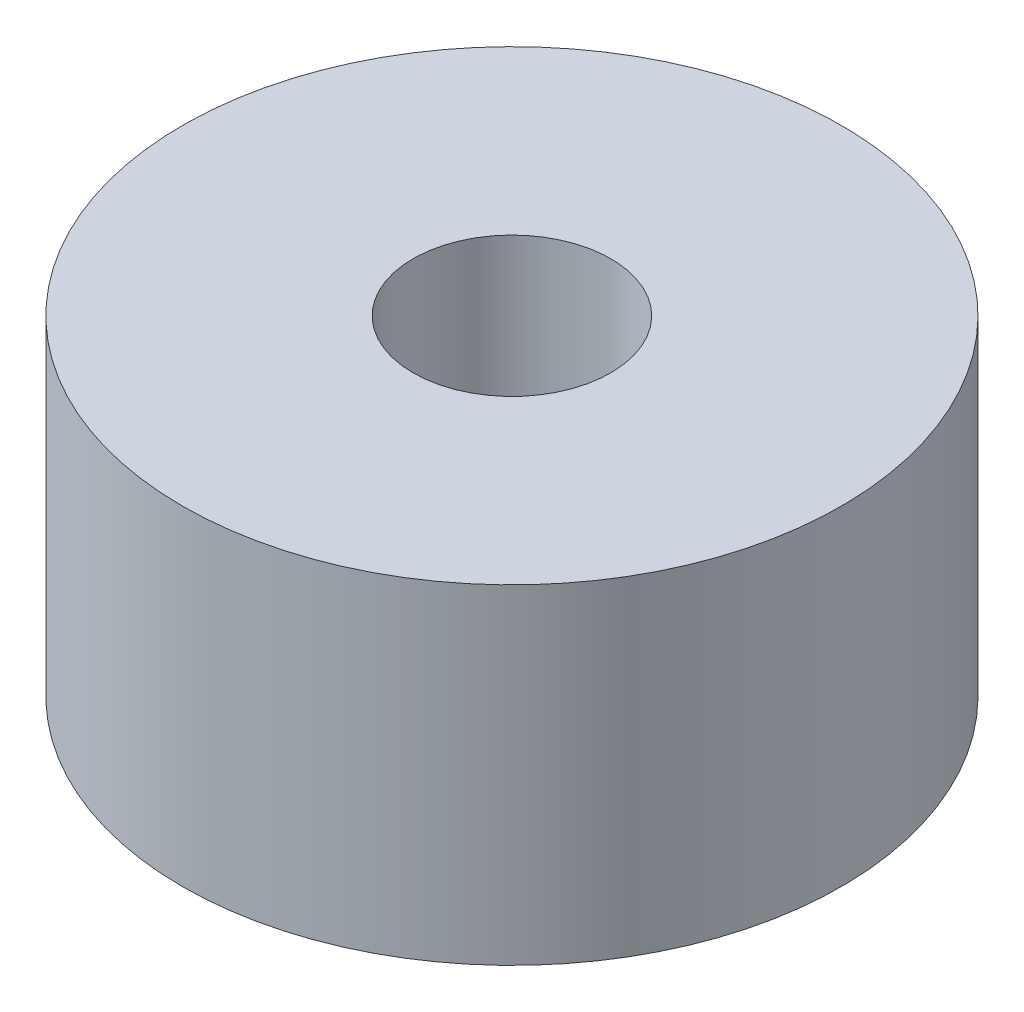
ISO-10303-21;
HEADER;
FILE_DESCRIPTION(('STEP AP214'),'2;1');
FILE_NAME('part.step','',(''),(''),'','','');
FILE_SCHEMA(('AUTOMOTIVE_DESIGN { 1 0 10303 214 1 1 1 1 }'));
ENDSEC;
DATA;
#1=APPLICATION_CONTEXT('core data for automotive mechanical design processes');
#2=APPLICATION_PROTOCOL_DEFINITION('international standard','automotive_design',2000,#1);
#3=PRODUCT_CONTEXT('',#1,'mechanical');
#4=PRODUCT('Part','Part','',(#3));
#5=PRODUCT_RELATED_PRODUCT_CATEGORY('part','',(#4));
#6=PRODUCT_DEFINITION_FORMATION('','',#4);
#7=PRODUCT_DEFINITION_CONTEXT('part definition',#1,'design');
#8=PRODUCT_DEFINITION('design','',#6,#7);
#9=PRODUCT_DEFINITION_SHAPE('','',#8);
#10=(LENGTH_UNIT() NAMED_UNIT(*) SI_UNIT(.MILLI.,.METRE.));
#11=(NAMED_UNIT(*) PLANE_ANGLE_UNIT() SI_UNIT($,.RADIAN.));
#12=(NAMED_UNIT(*) SI_UNIT($,.STERADIAN.) SOLID_ANGLE_UNIT());
#13=UNCERTAINTY_MEASURE_WITH_UNIT(LENGTH_MEASURE(1.E-05),#10,'distance_accuracy_value','');
#14=(GEOMETRIC_REPRESENTATION_CONTEXT(3) GLOBAL_UNCERTAINTY_ASSIGNED_CONTEXT((#13)) GLOBAL_UNIT_ASSIGNED_CONTEXT((#10,
#11,#12)) REPRESENTATION_CONTEXT('',''));
#15=CARTESIAN_POINT('',(0.,0.,0.));
#16=DIRECTION('',(0.,0.,1.));
#17=DIRECTION('',(1.,0.,0.));
#18=AXIS2_PLACEMENT_3D('',#15,#16,#17);
#19=CARTESIAN_POINT('',(0.,50.,100.));
#20=DIRECTION('',(0.,1.,0.));
#21=DIRECTION('',(0.,0.,1.));
#22=AXIS2_PLACEMENT_3D('',#19,#20,#21);
#23=PLANE('',#22);
#24=CARTESIAN_POINT('',(0.,50.,0.));
#25=DIRECTION('',(0.,1.,0.));
#26=DIRECTION('',(0.,0.,1.));
#27=AXIS2_PLACEMENT_3D('',#24,#25,#26);
#28=CIRCLE('',#27,100.);
#29=CARTESIAN_POINT('',(0.,50.,100.));
#30=VERTEX_POINT('',#29);
#31=EDGE_CURVE('E45',#30,#30,#28,.T.);
#32=ORIENTED_EDGE('',*,*,#31,.T.);
#33=EDGE_LOOP('',(#32));
#34=FACE_BOUND('',#33,.T.);
#35=CARTESIAN_POINT('',(0.,50.,0.));
#36=DIRECTION('',(0.,1.,0.));
#37=DIRECTION('',(0.,0.,1.));
#38=AXIS2_PLACEMENT_3D('',#35,#36,#37);
#39=CIRCLE('',#38,30.);
#40=CARTESIAN_POINT('',(0.,50.,30.));
#41=VERTEX_POINT('',#40);
#42=EDGE_CURVE('E10',#41,#41,#39,.T.);
#43=ORIENTED_EDGE('',*,*,#42,.F.);
#44=EDGE_LOOP('',(#43));
#45=FACE_BOUND('',#44,.T.);
#46=ADVANCED_FACE('F31',(#34,#45),#23,.T.);
#47=CARTESIAN_POINT('',(0.,96.9716572526191,0.));
#48=DIRECTION('',(0.,1.,0.));
#49=DIRECTION('',(0.,0.,1.));
#50=AXIS2_PLACEMENT_3D('',#47,#48,#49);
#51=CYLINDRICAL_SURFACE('',#50,30.);
#52=ORIENTED_EDGE('',*,*,#42,.T.);
#53=EDGE_LOOP('',(#52));
#54=FACE_BOUND('',#53,.T.);
#55=CARTESIAN_POINT('',(0.,-50.,0.));
#56=DIRECTION('',(0.,1.,0.));
#57=DIRECTION('',(0.,0.,1.));
#58=AXIS2_PLACEMENT_3D('',#55,#56,#57);
#59=CIRCLE('',#58,30.);
#60=CARTESIAN_POINT('',(0.,-50.,30.));
#61=VERTEX_POINT('',#60);
#62=EDGE_CURVE('E37',#61,#61,#59,.T.);
#63=ORIENTED_EDGE('',*,*,#62,.F.);
#64=EDGE_LOOP('',(#63));
#65=FACE_BOUND('',#64,.T.);
#66=ADVANCED_FACE('F61',(#54,#65),#51,.F.);
#67=CARTESIAN_POINT('',(0.,-50.,30.));
#68=DIRECTION('',(0.,-1.,0.));
#69=DIRECTION('',(0.,0.,-1.));
#70=AXIS2_PLACEMENT_3D('',#67,#68,#69);
#71=PLANE('',#70);
#72=ORIENTED_EDGE('',*,*,#62,.T.);
#73=EDGE_LOOP('',(#72));
#74=FACE_BOUND('',#73,.T.);
#75=CARTESIAN_POINT('',(0.,-50.,0.));
#76=DIRECTION('',(0.,1.,0.));
#77=DIRECTION('',(0.,0.,1.));
#78=AXIS2_PLACEMENT_3D('',#75,#76,#77);
#79=CIRCLE('',#78,100.);
#80=CARTESIAN_POINT('',(0.,-50.,100.));
#81=VERTEX_POINT('',#80);
#82=EDGE_CURVE('E41',#81,#81,#79,.T.);
#83=ORIENTED_EDGE('',*,*,#82,.F.);
#84=EDGE_LOOP('',(#83));
#85=FACE_BOUND('',#84,.T.);
#86=ADVANCED_FACE('F55',(#74,#85),#71,.T.);
#87=CARTESIAN_POINT('',(0.,96.9716572526191,0.));
#88=DIRECTION('',(0.,1.,0.));
#89=DIRECTION('',(0.,0.,1.));
#90=AXIS2_PLACEMENT_3D('',#87,#88,#89);
#91=CYLINDRICAL_SURFACE('',#90,100.);
#92=ORIENTED_EDGE('',*,*,#82,.T.);
#93=EDGE_LOOP('',(#92));
#94=FACE_BOUND('',#93,.T.);
#95=ORIENTED_EDGE('',*,*,#31,.F.);
#96=EDGE_LOOP('',(#95));
#97=FACE_BOUND('',#96,.T.);
#98=ADVANCED_FACE('F53',(#94,#97),#91,.T.);
#99=CLOSED_SHELL('',(#46,#66,#86,#98));
#100=MANIFOLD_SOLID_BREP('B2',#99);
#101=ADVANCED_BREP_SHAPE_REPRESENTATION('',(#18,#100),#14);
#102=SHAPE_DEFINITION_REPRESENTATION(#9,#101);
ENDSEC;
END-ISO-10303-21;
